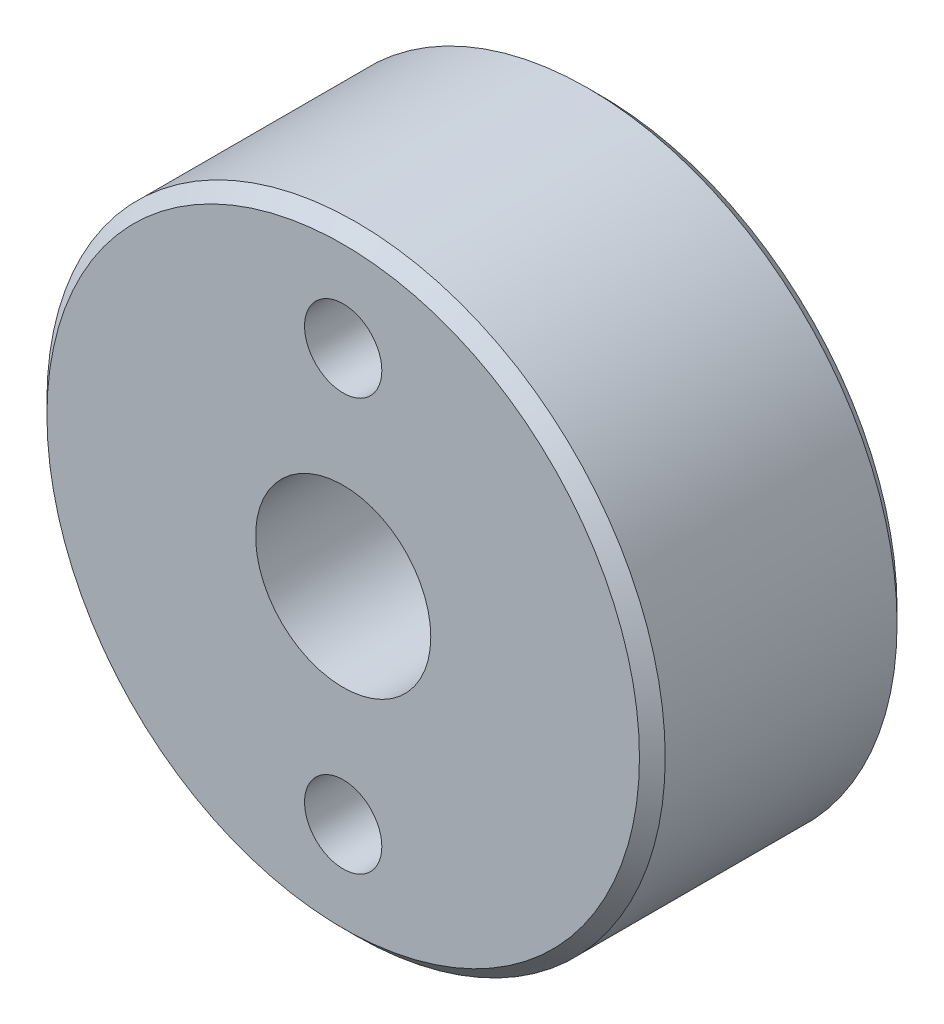
ISO-10303-21;
HEADER;
FILE_DESCRIPTION(('STEP AP214'),'2;1');
FILE_NAME('part.step','',(''),(''),'','','');
FILE_SCHEMA(('AUTOMOTIVE_DESIGN { 1 0 10303 214 1 1 1 1 }'));
ENDSEC;
DATA;
#1=APPLICATION_CONTEXT('core data for automotive mechanical design processes');
#2=APPLICATION_PROTOCOL_DEFINITION('international standard','automotive_design',2000,#1);
#3=PRODUCT_CONTEXT('',#1,'mechanical');
#4=PRODUCT('Part','Part','',(#3));
#5=PRODUCT_RELATED_PRODUCT_CATEGORY('part','',(#4));
#6=PRODUCT_DEFINITION_FORMATION('','',#4);
#7=PRODUCT_DEFINITION_CONTEXT('part definition',#1,'design');
#8=PRODUCT_DEFINITION('design','',#6,#7);
#9=PRODUCT_DEFINITION_SHAPE('','',#8);
#10=(LENGTH_UNIT() NAMED_UNIT(*) SI_UNIT(.MILLI.,.METRE.));
#11=(NAMED_UNIT(*) PLANE_ANGLE_UNIT() SI_UNIT($,.RADIAN.));
#12=(NAMED_UNIT(*) SI_UNIT($,.STERADIAN.) SOLID_ANGLE_UNIT());
#13=UNCERTAINTY_MEASURE_WITH_UNIT(LENGTH_MEASURE(1.E-05),#10,'distance_accuracy_value','');
#14=(GEOMETRIC_REPRESENTATION_CONTEXT(3) GLOBAL_UNCERTAINTY_ASSIGNED_CONTEXT((#13)) GLOBAL_UNIT_ASSIGNED_CONTEXT((#10,
#11,#12)) REPRESENTATION_CONTEXT('',''));
#15=CARTESIAN_POINT('',(0.,0.,0.));
#16=DIRECTION('',(0.,0.,1.));
#17=DIRECTION('',(1.,0.,0.));
#18=AXIS2_PLACEMENT_3D('',#15,#16,#17);
#19=CARTESIAN_POINT('',(0.,0.,10.));
#20=DIRECTION('',(0.,0.,-1.));
#21=DIRECTION('',(-1.,0.,0.));
#22=AXIS2_PLACEMENT_3D('',#19,#20,#21);
#23=CYLINDRICAL_SURFACE('',#22,12.);
#24=CARTESIAN_POINT('',(0.,0.,0.5));
#25=DIRECTION('',(0.,0.,1.));
#26=DIRECTION('',(1.,0.,0.));
#27=AXIS2_PLACEMENT_3D('',#24,#25,#26);
#28=CIRCLE('',#27,12.);
#29=CARTESIAN_POINT('',(12.,0.,0.5));
#30=VERTEX_POINT('',#29);
#31=EDGE_CURVE('E57',#30,#30,#28,.T.);
#32=ORIENTED_EDGE('',*,*,#31,.T.);
#33=EDGE_LOOP('',(#32));
#34=FACE_BOUND('',#33,.T.);
#35=CARTESIAN_POINT('',(0.,0.,9.49999999999999));
#36=DIRECTION('',(0.,0.,1.));
#37=DIRECTION('',(1.,0.,0.));
#38=AXIS2_PLACEMENT_3D('',#35,#36,#37);
#39=CIRCLE('',#38,12.);
#40=CARTESIAN_POINT('',(12.,0.,9.49999999999999));
#41=VERTEX_POINT('',#40);
#42=EDGE_CURVE('E63',#41,#41,#39,.F.);
#43=ORIENTED_EDGE('',*,*,#42,.T.);
#44=EDGE_LOOP('',(#43));
#45=FACE_BOUND('',#44,.T.);
#46=ADVANCED_FACE('F43',(#34,#45),#23,.T.);
#47=CARTESIAN_POINT('',(0.,0.,10.));
#48=DIRECTION('',(0.,0.,1.));
#49=DIRECTION('',(1.,0.,0.));
#50=AXIS2_PLACEMENT_3D('',#47,#48,#49);
#51=PLANE('',#50);
#52=CARTESIAN_POINT('',(0.,8.,10.));
#53=DIRECTION('',(0.,0.,1.));
#54=DIRECTION('',(1.,0.,0.));
#55=AXIS2_PLACEMENT_3D('',#52,#53,#54);
#56=CIRCLE('',#55,1.5);
#57=CARTESIAN_POINT('',(1.5,8.,10.));
#58=VERTEX_POINT('',#57);
#59=EDGE_CURVE('E77',#58,#58,#56,.T.);
#60=ORIENTED_EDGE('',*,*,#59,.F.);
#61=EDGE_LOOP('',(#60));
#62=FACE_BOUND('',#61,.T.);
#63=CARTESIAN_POINT('',(0.,-8.,10.));
#64=DIRECTION('',(0.,0.,1.));
#65=DIRECTION('',(1.,0.,0.));
#66=AXIS2_PLACEMENT_3D('',#63,#64,#65);
#67=CIRCLE('',#66,1.5);
#68=CARTESIAN_POINT('',(1.5,-8.,10.));
#69=VERTEX_POINT('',#68);
#70=EDGE_CURVE('E67',#69,#69,#67,.T.);
#71=ORIENTED_EDGE('',*,*,#70,.F.);
#72=EDGE_LOOP('',(#71));
#73=FACE_BOUND('',#72,.T.);
#74=CARTESIAN_POINT('',(0.,0.,10.));
#75=DIRECTION('',(0.,0.,1.));
#76=DIRECTION('',(1.,0.,0.));
#77=AXIS2_PLACEMENT_3D('',#74,#75,#76);
#78=CIRCLE('',#77,3.39999999999999);
#79=CARTESIAN_POINT('',(3.39999999999999,0.,10.));
#80=VERTEX_POINT('',#79);
#81=EDGE_CURVE('E64',#80,#80,#78,.T.);
#82=ORIENTED_EDGE('',*,*,#81,.F.);
#83=EDGE_LOOP('',(#82));
#84=FACE_BOUND('',#83,.T.);
#85=CARTESIAN_POINT('',(0.,0.,10.));
#86=DIRECTION('',(0.,0.,1.));
#87=DIRECTION('',(1.,0.,0.));
#88=AXIS2_PLACEMENT_3D('',#85,#86,#87);
#89=CIRCLE('',#88,11.5);
#90=CARTESIAN_POINT('',(11.5,0.,10.));
#91=VERTEX_POINT('',#90);
#92=EDGE_CURVE('E10',#91,#91,#89,.T.);
#93=ORIENTED_EDGE('',*,*,#92,.T.);
#94=EDGE_LOOP('',(#93));
#95=FACE_BOUND('',#94,.T.);
#96=ADVANCED_FACE('F97',(#62,#73,#84,#95),#51,.T.);
#97=CARTESIAN_POINT('',(0.,0.,0.));
#98=DIRECTION('',(0.,0.,1.));
#99=DIRECTION('',(1.,0.,0.));
#100=AXIS2_PLACEMENT_3D('',#97,#98,#99);
#101=PLANE('',#100);
#102=CARTESIAN_POINT('',(0.,8.,0.));
#103=DIRECTION('',(0.,0.,1.));
#104=DIRECTION('',(1.,0.,0.));
#105=AXIS2_PLACEMENT_3D('',#102,#103,#104);
#106=CIRCLE('',#105,1.5);
#107=CARTESIAN_POINT('',(1.5,8.,0.));
#108=VERTEX_POINT('',#107);
#109=EDGE_CURVE('E48',#108,#108,#106,.T.);
#110=ORIENTED_EDGE('',*,*,#109,.T.);
#111=EDGE_LOOP('',(#110));
#112=FACE_BOUND('',#111,.T.);
#113=CARTESIAN_POINT('',(0.,-8.,0.));
#114=DIRECTION('',(0.,0.,1.));
#115=DIRECTION('',(1.,0.,0.));
#116=AXIS2_PLACEMENT_3D('',#113,#114,#115);
#117=CIRCLE('',#116,1.5);
#118=CARTESIAN_POINT('',(1.5,-8.,0.));
#119=VERTEX_POINT('',#118);
#120=EDGE_CURVE('E65',#119,#119,#117,.T.);
#121=ORIENTED_EDGE('',*,*,#120,.T.);
#122=EDGE_LOOP('',(#121));
#123=FACE_BOUND('',#122,.T.);
#124=CARTESIAN_POINT('',(0.,0.,0.));
#125=DIRECTION('',(0.,0.,1.));
#126=DIRECTION('',(1.,0.,0.));
#127=AXIS2_PLACEMENT_3D('',#124,#125,#126);
#128=CIRCLE('',#127,3.39999999999999);
#129=CARTESIAN_POINT('',(3.39999999999999,0.,0.));
#130=VERTEX_POINT('',#129);
#131=EDGE_CURVE('E61',#130,#130,#128,.T.);
#132=ORIENTED_EDGE('',*,*,#131,.T.);
#133=EDGE_LOOP('',(#132));
#134=FACE_BOUND('',#133,.T.);
#135=CARTESIAN_POINT('',(0.,0.,0.));
#136=DIRECTION('',(0.,0.,1.));
#137=DIRECTION('',(1.,0.,0.));
#138=AXIS2_PLACEMENT_3D('',#135,#136,#137);
#139=CIRCLE('',#138,11.5);
#140=CARTESIAN_POINT('',(11.5,0.,0.));
#141=VERTEX_POINT('',#140);
#142=EDGE_CURVE('E52',#141,#141,#139,.F.);
#143=ORIENTED_EDGE('',*,*,#142,.T.);
#144=EDGE_LOOP('',(#143));
#145=FACE_BOUND('',#144,.T.);
#146=ADVANCED_FACE('F88',(#112,#123,#134,#145),#101,.F.);
#147=CARTESIAN_POINT('',(0.,0.,0.5));
#148=DIRECTION('',(0.,0.,1.));
#149=DIRECTION('',(1.,0.,0.));
#150=AXIS2_PLACEMENT_3D('',#147,#148,#149);
#151=CONICAL_SURFACE('',#150,12.,0.78539816339745);
#152=ORIENTED_EDGE('',*,*,#142,.F.);
#153=EDGE_LOOP('',(#152));
#154=FACE_BOUND('',#153,.T.);
#155=ORIENTED_EDGE('',*,*,#31,.F.);
#156=EDGE_LOOP('',(#155));
#157=FACE_BOUND('',#156,.T.);
#158=ADVANCED_FACE('F86',(#154,#157),#151,.T.);
#159=CARTESIAN_POINT('',(0.,0.,10.));
#160=DIRECTION('',(0.,0.,-1.));
#161=DIRECTION('',(-1.,0.,0.));
#162=AXIS2_PLACEMENT_3D('',#159,#160,#161);
#163=CONICAL_SURFACE('',#162,11.5,0.78539816339744);
#164=ORIENTED_EDGE('',*,*,#42,.F.);
#165=EDGE_LOOP('',(#164));
#166=FACE_BOUND('',#165,.T.);
#167=ORIENTED_EDGE('',*,*,#92,.F.);
#168=EDGE_LOOP('',(#167));
#169=FACE_BOUND('',#168,.T.);
#170=ADVANCED_FACE('F46',(#166,#169),#163,.T.);
#171=CARTESIAN_POINT('',(0.,0.,10.));
#172=DIRECTION('',(0.,0.,1.));
#173=DIRECTION('',(1.,0.,0.));
#174=AXIS2_PLACEMENT_3D('',#171,#172,#173);
#175=CYLINDRICAL_SURFACE('',#174,3.39999999999999);
#176=ORIENTED_EDGE('',*,*,#81,.T.);
#177=EDGE_LOOP('',(#176));
#178=FACE_BOUND('',#177,.T.);
#179=ORIENTED_EDGE('',*,*,#131,.F.);
#180=EDGE_LOOP('',(#179));
#181=FACE_BOUND('',#180,.T.);
#182=ADVANCED_FACE('F94',(#178,#181),#175,.F.);
#183=CARTESIAN_POINT('',(0.,-8.,10.));
#184=DIRECTION('',(0.,0.,1.));
#185=DIRECTION('',(1.,0.,0.));
#186=AXIS2_PLACEMENT_3D('',#183,#184,#185);
#187=CYLINDRICAL_SURFACE('',#186,1.5);
#188=ORIENTED_EDGE('',*,*,#70,.T.);
#189=EDGE_LOOP('',(#188));
#190=FACE_BOUND('',#189,.T.);
#191=ORIENTED_EDGE('',*,*,#120,.F.);
#192=EDGE_LOOP('',(#191));
#193=FACE_BOUND('',#192,.T.);
#194=ADVANCED_FACE('F112',(#190,#193),#187,.F.);
#195=CARTESIAN_POINT('',(0.,8.,10.));
#196=DIRECTION('',(0.,0.,1.));
#197=DIRECTION('',(1.,0.,0.));
#198=AXIS2_PLACEMENT_3D('',#195,#196,#197);
#199=CYLINDRICAL_SURFACE('',#198,1.5);
#200=ORIENTED_EDGE('',*,*,#59,.T.);
#201=EDGE_LOOP('',(#200));
#202=FACE_BOUND('',#201,.T.);
#203=ORIENTED_EDGE('',*,*,#109,.F.);
#204=EDGE_LOOP('',(#203));
#205=FACE_BOUND('',#204,.T.);
#206=ADVANCED_FACE('F116',(#202,#205),#199,.F.);
#207=CLOSED_SHELL('',(#46,#96,#146,#158,#170,#182,#194,#206));
#208=MANIFOLD_SOLID_BREP('B2',#207);
#209=ADVANCED_BREP_SHAPE_REPRESENTATION('',(#18,#208),#14);
#210=SHAPE_DEFINITION_REPRESENTATION(#9,#209);
ENDSEC;
END-ISO-10303-21;
